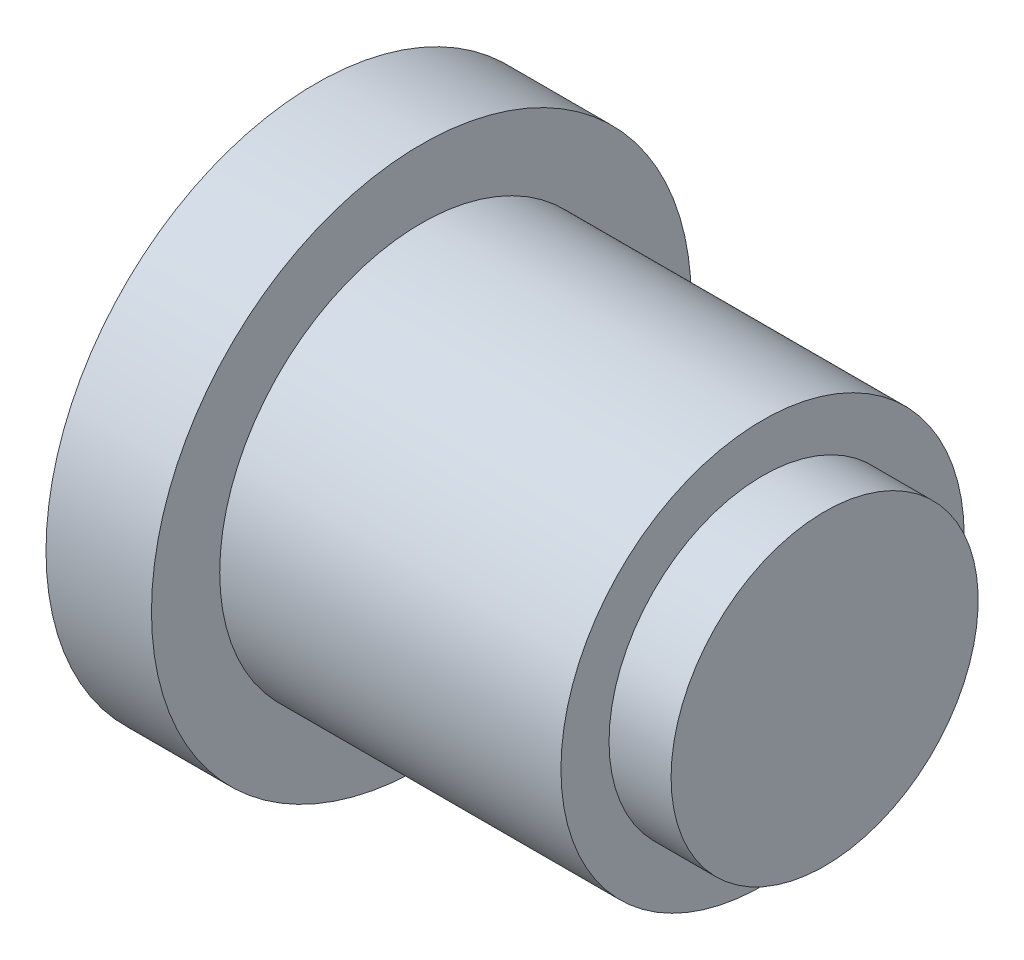
ISO-10303-21;
HEADER;
FILE_DESCRIPTION(('STEP AP214'),'2;1');
FILE_NAME('part.step','',(''),(''),'','','');
FILE_SCHEMA(('AUTOMOTIVE_DESIGN { 1 0 10303 214 1 1 1 1 }'));
ENDSEC;
DATA;
#1=APPLICATION_CONTEXT('core data for automotive mechanical design processes');
#2=APPLICATION_PROTOCOL_DEFINITION('international standard','automotive_design',2000,#1);
#3=PRODUCT_CONTEXT('',#1,'mechanical');
#4=PRODUCT('Part','Part','',(#3));
#5=PRODUCT_RELATED_PRODUCT_CATEGORY('part','',(#4));
#6=PRODUCT_DEFINITION_FORMATION('','',#4);
#7=PRODUCT_DEFINITION_CONTEXT('part definition',#1,'design');
#8=PRODUCT_DEFINITION('design','',#6,#7);
#9=PRODUCT_DEFINITION_SHAPE('','',#8);
#10=(LENGTH_UNIT() NAMED_UNIT(*) SI_UNIT(.MILLI.,.METRE.));
#11=(NAMED_UNIT(*) PLANE_ANGLE_UNIT() SI_UNIT($,.RADIAN.));
#12=(NAMED_UNIT(*) SI_UNIT($,.STERADIAN.) SOLID_ANGLE_UNIT());
#13=UNCERTAINTY_MEASURE_WITH_UNIT(LENGTH_MEASURE(1.E-05),#10,'distance_accuracy_value','');
#14=(GEOMETRIC_REPRESENTATION_CONTEXT(3) GLOBAL_UNCERTAINTY_ASSIGNED_CONTEXT((#13)) GLOBAL_UNIT_ASSIGNED_CONTEXT((#10,
#11,#12)) REPRESENTATION_CONTEXT('',''));
#15=CARTESIAN_POINT('',(0.,0.,0.));
#16=DIRECTION('',(0.,0.,1.));
#17=DIRECTION('',(1.,0.,0.));
#18=AXIS2_PLACEMENT_3D('',#15,#16,#17);
#19=CARTESIAN_POINT('',(0.,0.,0.));
#20=DIRECTION('',(1.,0.,0.));
#21=DIRECTION('',(0.,0.,-1.));
#22=AXIS2_PLACEMENT_3D('',#19,#20,#21);
#23=PLANE('',#22);
#24=CARTESIAN_POINT('',(0.,0.,0.));
#25=DIRECTION('',(-1.,0.,0.));
#26=DIRECTION('',(0.,0.,1.));
#27=AXIS2_PLACEMENT_3D('',#24,#25,#26);
#28=CIRCLE('',#27,87.);
#29=CARTESIAN_POINT('',(0.,0.,87.));
#30=VERTEX_POINT('',#29);
#31=EDGE_CURVE('E10',#30,#30,#28,.T.);
#32=ORIENTED_EDGE('',*,*,#31,.T.);
#33=EDGE_LOOP('',(#32));
#34=FACE_BOUND('',#33,.T.);
#35=ADVANCED_FACE('F37',(#34),#23,.F.);
#36=CARTESIAN_POINT('',(0.,0.,0.));
#37=DIRECTION('',(-1.,0.,0.));
#38=DIRECTION('',(0.,0.,1.));
#39=AXIS2_PLACEMENT_3D('',#36,#37,#38);
#40=CYLINDRICAL_SURFACE('',#39,87.);
#41=ORIENTED_EDGE('',*,*,#31,.F.);
#42=EDGE_LOOP('',(#41));
#43=FACE_BOUND('',#42,.T.);
#44=CARTESIAN_POINT('',(34.,0.,0.));
#45=DIRECTION('',(-1.,0.,0.));
#46=DIRECTION('',(0.,0.,1.));
#47=AXIS2_PLACEMENT_3D('',#44,#45,#46);
#48=CIRCLE('',#47,87.);
#49=CARTESIAN_POINT('',(34.,0.,87.));
#50=VERTEX_POINT('',#49);
#51=EDGE_CURVE('E43',#50,#50,#48,.T.);
#52=ORIENTED_EDGE('',*,*,#51,.T.);
#53=EDGE_LOOP('',(#52));
#54=FACE_BOUND('',#53,.T.);
#55=ADVANCED_FACE('F75',(#43,#54),#40,.T.);
#56=CARTESIAN_POINT('',(34.,87.,0.));
#57=DIRECTION('',(-1.,0.,0.));
#58=DIRECTION('',(0.,0.,1.));
#59=AXIS2_PLACEMENT_3D('',#56,#57,#58);
#60=PLANE('',#59);
#61=ORIENTED_EDGE('',*,*,#51,.F.);
#62=EDGE_LOOP('',(#61));
#63=FACE_BOUND('',#62,.T.);
#64=CARTESIAN_POINT('',(34.,0.,0.));
#65=DIRECTION('',(-1.,0.,0.));
#66=DIRECTION('',(0.,0.,1.));
#67=AXIS2_PLACEMENT_3D('',#64,#65,#66);
#68=CIRCLE('',#67,65.);
#69=CARTESIAN_POINT('',(34.,0.,65.));
#70=VERTEX_POINT('',#69);
#71=EDGE_CURVE('E47',#70,#70,#68,.T.);
#72=ORIENTED_EDGE('',*,*,#71,.T.);
#73=EDGE_LOOP('',(#72));
#74=FACE_BOUND('',#73,.T.);
#75=ADVANCED_FACE('F79',(#63,#74),#60,.F.);
#76=CARTESIAN_POINT('',(0.,0.,0.));
#77=DIRECTION('',(-1.,0.,0.));
#78=DIRECTION('',(0.,0.,1.));
#79=AXIS2_PLACEMENT_3D('',#76,#77,#78);
#80=CYLINDRICAL_SURFACE('',#79,65.);
#81=ORIENTED_EDGE('',*,*,#71,.F.);
#82=EDGE_LOOP('',(#81));
#83=FACE_BOUND('',#82,.T.);
#84=CARTESIAN_POINT('',(144.,0.,0.));
#85=DIRECTION('',(-1.,0.,0.));
#86=DIRECTION('',(0.,0.,1.));
#87=AXIS2_PLACEMENT_3D('',#84,#85,#86);
#88=CIRCLE('',#87,65.);
#89=CARTESIAN_POINT('',(144.,0.,65.));
#90=VERTEX_POINT('',#89);
#91=EDGE_CURVE('E51',#90,#90,#88,.T.);
#92=ORIENTED_EDGE('',*,*,#91,.T.);
#93=EDGE_LOOP('',(#92));
#94=FACE_BOUND('',#93,.T.);
#95=ADVANCED_FACE('F84',(#83,#94),#80,.T.);
#96=CARTESIAN_POINT('',(144.,65.,0.));
#97=DIRECTION('',(-1.,0.,0.));
#98=DIRECTION('',(0.,0.,1.));
#99=AXIS2_PLACEMENT_3D('',#96,#97,#98);
#100=PLANE('',#99);
#101=ORIENTED_EDGE('',*,*,#91,.F.);
#102=EDGE_LOOP('',(#101));
#103=FACE_BOUND('',#102,.T.);
#104=CARTESIAN_POINT('',(144.,0.,0.));
#105=DIRECTION('',(-1.,0.,0.));
#106=DIRECTION('',(0.,0.,1.));
#107=AXIS2_PLACEMENT_3D('',#104,#105,#106);
#108=CIRCLE('',#107,49.5);
#109=CARTESIAN_POINT('',(144.,0.,49.5));
#110=VERTEX_POINT('',#109);
#111=EDGE_CURVE('E56',#110,#110,#108,.T.);
#112=ORIENTED_EDGE('',*,*,#111,.T.);
#113=EDGE_LOOP('',(#112));
#114=FACE_BOUND('',#113,.T.);
#115=ADVANCED_FACE('F71',(#103,#114),#100,.F.);
#116=CARTESIAN_POINT('',(0.,0.,0.));
#117=DIRECTION('',(-1.,0.,0.));
#118=DIRECTION('',(0.,0.,1.));
#119=AXIS2_PLACEMENT_3D('',#116,#117,#118);
#120=CYLINDRICAL_SURFACE('',#119,49.5);
#121=ORIENTED_EDGE('',*,*,#111,.F.);
#122=EDGE_LOOP('',(#121));
#123=FACE_BOUND('',#122,.T.);
#124=CARTESIAN_POINT('',(164.,0.,0.));
#125=DIRECTION('',(-1.,0.,0.));
#126=DIRECTION('',(0.,0.,1.));
#127=AXIS2_PLACEMENT_3D('',#124,#125,#126);
#128=CIRCLE('',#127,49.5);
#129=CARTESIAN_POINT('',(164.,0.,49.5));
#130=VERTEX_POINT('',#129);
#131=EDGE_CURVE('E59',#130,#130,#128,.T.);
#132=ORIENTED_EDGE('',*,*,#131,.T.);
#133=EDGE_LOOP('',(#132));
#134=FACE_BOUND('',#133,.T.);
#135=ADVANCED_FACE('F63',(#123,#134),#120,.T.);
#136=CARTESIAN_POINT('',(164.,49.5,0.));
#137=DIRECTION('',(-1.,0.,0.));
#138=DIRECTION('',(0.,0.,1.));
#139=AXIS2_PLACEMENT_3D('',#136,#137,#138);
#140=PLANE('',#139);
#141=ORIENTED_EDGE('',*,*,#131,.F.);
#142=EDGE_LOOP('',(#141));
#143=FACE_BOUND('',#142,.T.);
#144=ADVANCED_FACE('F65',(#143),#140,.F.);
#145=CLOSED_SHELL('',(#35,#55,#75,#95,#115,#135,#144));
#146=MANIFOLD_SOLID_BREP('B2',#145);
#147=ADVANCED_BREP_SHAPE_REPRESENTATION('',(#18,#146),#14);
#148=SHAPE_DEFINITION_REPRESENTATION(#9,#147);
ENDSEC;
END-ISO-10303-21;
